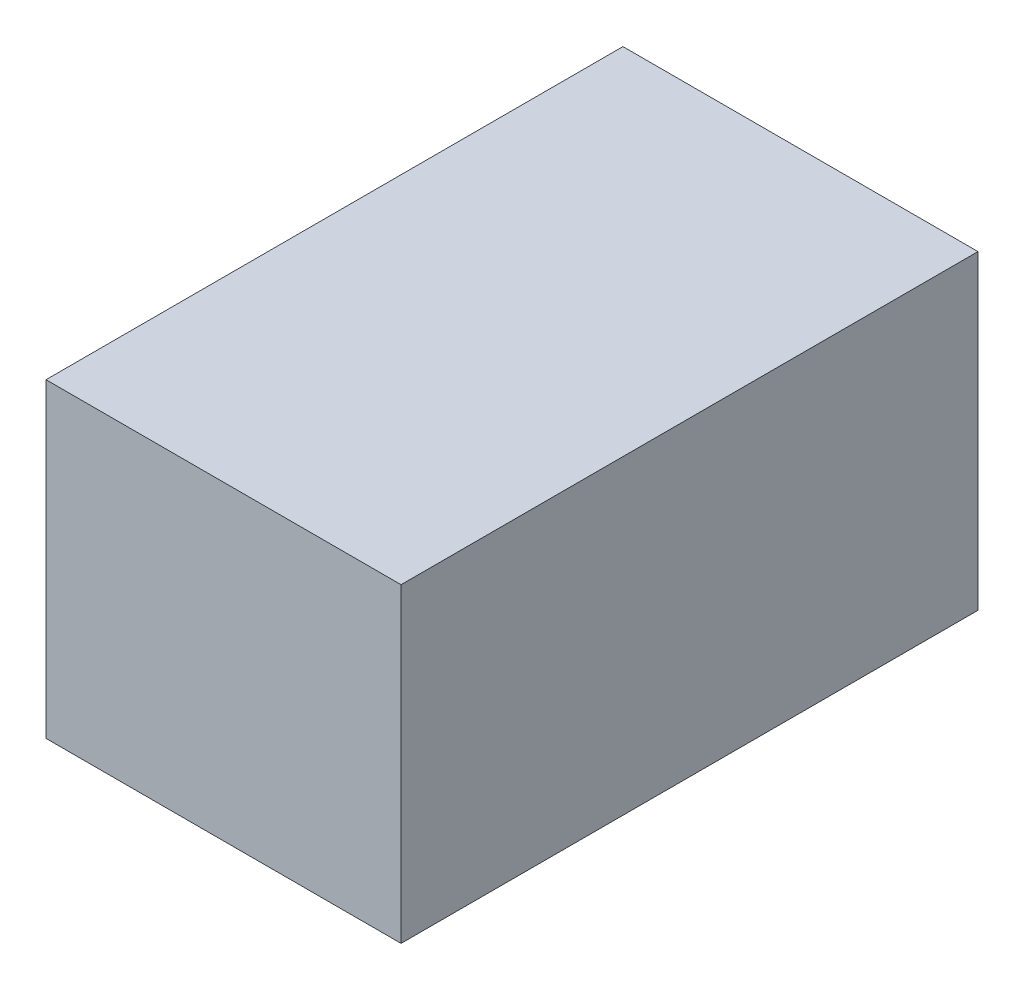
ISO-10303-21;
HEADER;
FILE_DESCRIPTION(('STEP AP214'),'2;1');
FILE_NAME('part.step','',(''),(''),'','','');
FILE_SCHEMA(('AUTOMOTIVE_DESIGN { 1 0 10303 214 1 1 1 1 }'));
ENDSEC;
DATA;
#1=APPLICATION_CONTEXT('core data for automotive mechanical design processes');
#2=APPLICATION_PROTOCOL_DEFINITION('international standard','automotive_design',2000,#1);
#3=PRODUCT_CONTEXT('',#1,'mechanical');
#4=PRODUCT('Part','Part','',(#3));
#5=PRODUCT_RELATED_PRODUCT_CATEGORY('part','',(#4));
#6=PRODUCT_DEFINITION_FORMATION('','',#4);
#7=PRODUCT_DEFINITION_CONTEXT('part definition',#1,'design');
#8=PRODUCT_DEFINITION('design','',#6,#7);
#9=PRODUCT_DEFINITION_SHAPE('','',#8);
#10=(LENGTH_UNIT() NAMED_UNIT(*) SI_UNIT(.MILLI.,.METRE.));
#11=(NAMED_UNIT(*) PLANE_ANGLE_UNIT() SI_UNIT($,.RADIAN.));
#12=(NAMED_UNIT(*) SI_UNIT($,.STERADIAN.) SOLID_ANGLE_UNIT());
#13=UNCERTAINTY_MEASURE_WITH_UNIT(LENGTH_MEASURE(1.E-05),#10,'distance_accuracy_value','');
#14=(GEOMETRIC_REPRESENTATION_CONTEXT(3) GLOBAL_UNCERTAINTY_ASSIGNED_CONTEXT((#13)) GLOBAL_UNIT_ASSIGNED_CONTEXT((#10,
#11,#12)) REPRESENTATION_CONTEXT('',''));
#15=CARTESIAN_POINT('',(0.,0.,0.));
#16=DIRECTION('',(0.,0.,1.));
#17=DIRECTION('',(1.,0.,0.));
#18=AXIS2_PLACEMENT_3D('',#15,#16,#17);
#19=CARTESIAN_POINT('',(800.,1400.,2300.));
#20=DIRECTION('',(0.,0.,-1.));
#21=DIRECTION('',(-1.,0.,0.));
#22=AXIS2_PLACEMENT_3D('',#19,#20,#21);
#23=PLANE('',#22);
#24=DIRECTION('',(0.,-1.,0.));
#25=VECTOR('',#24,1.);
#26=CARTESIAN_POINT('',(-800.,1400.,2300.));
#27=LINE('',#26,#25);
#28=CARTESIAN_POINT('',(-800.,1400.,2300.));
#29=VERTEX_POINT('',#28);
#30=CARTESIAN_POINT('',(-800.,0.,2300.));
#31=VERTEX_POINT('',#30);
#32=EDGE_CURVE('E96',#29,#31,#27,.T.);
#33=ORIENTED_EDGE('',*,*,#32,.T.);
#34=DIRECTION('',(-1.,0.,0.));
#35=VECTOR('',#34,1.);
#36=CARTESIAN_POINT('',(800.,0.,2300.));
#37=LINE('',#36,#35);
#38=CARTESIAN_POINT('',(800.,0.,2300.));
#39=VERTEX_POINT('',#38);
#40=EDGE_CURVE('E11',#39,#31,#37,.T.);
#41=ORIENTED_EDGE('',*,*,#40,.F.);
#42=DIRECTION('',(0.,-1.,0.));
#43=VECTOR('',#42,1.);
#44=CARTESIAN_POINT('',(800.,1400.,2300.));
#45=LINE('',#44,#43);
#46=CARTESIAN_POINT('',(800.,1400.,2300.));
#47=VERTEX_POINT('',#46);
#48=EDGE_CURVE('E84',#47,#39,#45,.T.);
#49=ORIENTED_EDGE('',*,*,#48,.F.);
#50=DIRECTION('',(-1.,0.,0.));
#51=VECTOR('',#50,1.);
#52=CARTESIAN_POINT('',(800.,1400.,2300.));
#53=LINE('',#52,#51);
#54=EDGE_CURVE('E92',#47,#29,#53,.T.);
#55=ORIENTED_EDGE('',*,*,#54,.T.);
#56=EDGE_LOOP('',(#33,#41,#49,#55));
#57=FACE_BOUND('',#56,.T.);
#58=ADVANCED_FACE('F33',(#57),#23,.F.);
#59=CARTESIAN_POINT('',(800.,0.,2300.));
#60=DIRECTION('',(0.,1.,0.));
#61=DIRECTION('',(0.,0.,1.));
#62=AXIS2_PLACEMENT_3D('',#59,#60,#61);
#63=PLANE('',#62);
#64=DIRECTION('',(0.,0.,-1.));
#65=VECTOR('',#64,1.);
#66=CARTESIAN_POINT('',(-800.,0.,2300.));
#67=LINE('',#66,#65);
#68=CARTESIAN_POINT('',(-800.,0.,-300.));
#69=VERTEX_POINT('',#68);
#70=EDGE_CURVE('E88',#31,#69,#67,.T.);
#71=ORIENTED_EDGE('',*,*,#70,.T.);
#72=DIRECTION('',(-1.,0.,0.));
#73=VECTOR('',#72,1.);
#74=CARTESIAN_POINT('',(800.,0.,-300.));
#75=LINE('',#74,#73);
#76=CARTESIAN_POINT('',(800.,0.,-300.));
#77=VERTEX_POINT('',#76);
#78=EDGE_CURVE('E41',#77,#69,#75,.T.);
#79=ORIENTED_EDGE('',*,*,#78,.F.);
#80=DIRECTION('',(0.,0.,-1.));
#81=VECTOR('',#80,1.);
#82=CARTESIAN_POINT('',(800.,0.,2300.));
#83=LINE('',#82,#81);
#84=EDGE_CURVE('E79',#39,#77,#83,.T.);
#85=ORIENTED_EDGE('',*,*,#84,.F.);
#86=ORIENTED_EDGE('',*,*,#40,.T.);
#87=EDGE_LOOP('',(#71,#79,#85,#86));
#88=FACE_BOUND('',#87,.T.);
#89=ADVANCED_FACE('F87',(#88),#63,.F.);
#90=CARTESIAN_POINT('',(800.,1400.,-300.));
#91=DIRECTION('',(0.,0.,1.));
#92=DIRECTION('',(0.,-1.,0.));
#93=AXIS2_PLACEMENT_3D('',#90,#91,#92);
#94=PLANE('',#93);
#95=DIRECTION('',(0.,1.,0.));
#96=VECTOR('',#95,1.);
#97=CARTESIAN_POINT('',(-800.,1400.,-300.));
#98=LINE('',#97,#96);
#99=CARTESIAN_POINT('',(-800.,1400.,-300.));
#100=VERTEX_POINT('',#99);
#101=EDGE_CURVE('E66',#69,#100,#98,.T.);
#102=ORIENTED_EDGE('',*,*,#101,.T.);
#103=DIRECTION('',(-1.,0.,0.));
#104=VECTOR('',#103,1.);
#105=CARTESIAN_POINT('',(800.,1400.,-300.));
#106=LINE('',#105,#104);
#107=CARTESIAN_POINT('',(800.,1400.,-300.));
#108=VERTEX_POINT('',#107);
#109=EDGE_CURVE('E89',#108,#100,#106,.T.);
#110=ORIENTED_EDGE('',*,*,#109,.F.);
#111=DIRECTION('',(0.,1.,0.));
#112=VECTOR('',#111,1.);
#113=CARTESIAN_POINT('',(800.,1400.,-300.));
#114=LINE('',#113,#112);
#115=EDGE_CURVE('E82',#77,#108,#114,.T.);
#116=ORIENTED_EDGE('',*,*,#115,.F.);
#117=ORIENTED_EDGE('',*,*,#78,.T.);
#118=EDGE_LOOP('',(#102,#110,#116,#117));
#119=FACE_BOUND('',#118,.T.);
#120=ADVANCED_FACE('F90',(#119),#94,.F.);
#121=CARTESIAN_POINT('',(800.,1400.,2300.));
#122=DIRECTION('',(0.,-1.,0.));
#123=DIRECTION('',(0.,0.,-1.));
#124=AXIS2_PLACEMENT_3D('',#121,#122,#123);
#125=PLANE('',#124);
#126=DIRECTION('',(0.,0.,1.));
#127=VECTOR('',#126,1.);
#128=CARTESIAN_POINT('',(-800.,1400.,2300.));
#129=LINE('',#128,#127);
#130=EDGE_CURVE('E72',#100,#29,#129,.T.);
#131=ORIENTED_EDGE('',*,*,#130,.T.);
#132=ORIENTED_EDGE('',*,*,#54,.F.);
#133=DIRECTION('',(0.,0.,1.));
#134=VECTOR('',#133,1.);
#135=CARTESIAN_POINT('',(800.,1400.,2300.));
#136=LINE('',#135,#134);
#137=EDGE_CURVE('E49',#108,#47,#136,.T.);
#138=ORIENTED_EDGE('',*,*,#137,.F.);
#139=ORIENTED_EDGE('',*,*,#109,.T.);
#140=EDGE_LOOP('',(#131,#132,#138,#139));
#141=FACE_BOUND('',#140,.T.);
#142=ADVANCED_FACE('F103',(#141),#125,.F.);
#143=CARTESIAN_POINT('',(800.,0.,0.));
#144=DIRECTION('',(1.,0.,0.));
#145=DIRECTION('',(0.,0.,-1.));
#146=AXIS2_PLACEMENT_3D('',#143,#144,#145);
#147=PLANE('',#146);
#148=ORIENTED_EDGE('',*,*,#48,.T.);
#149=ORIENTED_EDGE('',*,*,#84,.T.);
#150=ORIENTED_EDGE('',*,*,#115,.T.);
#151=ORIENTED_EDGE('',*,*,#137,.T.);
#152=EDGE_LOOP('',(#148,#149,#150,#151));
#153=FACE_BOUND('',#152,.T.);
#154=ADVANCED_FACE('F80',(#153),#147,.T.);
#155=CARTESIAN_POINT('',(-800.,0.,0.));
#156=DIRECTION('',(1.,0.,0.));
#157=DIRECTION('',(0.,0.,-1.));
#158=AXIS2_PLACEMENT_3D('',#155,#156,#157);
#159=PLANE('',#158);
#160=ORIENTED_EDGE('',*,*,#32,.F.);
#161=ORIENTED_EDGE('',*,*,#130,.F.);
#162=ORIENTED_EDGE('',*,*,#101,.F.);
#163=ORIENTED_EDGE('',*,*,#70,.F.);
#164=EDGE_LOOP('',(#160,#161,#162,#163));
#165=FACE_BOUND('',#164,.T.);
#166=ADVANCED_FACE('F106',(#165),#159,.F.);
#167=CLOSED_SHELL('',(#58,#89,#120,#142,#154,#166));
#168=MANIFOLD_SOLID_BREP('B2',#167);
#169=ADVANCED_BREP_SHAPE_REPRESENTATION('',(#18,#168),#14);
#170=SHAPE_DEFINITION_REPRESENTATION(#9,#169);
ENDSEC;
END-ISO-10303-21;
